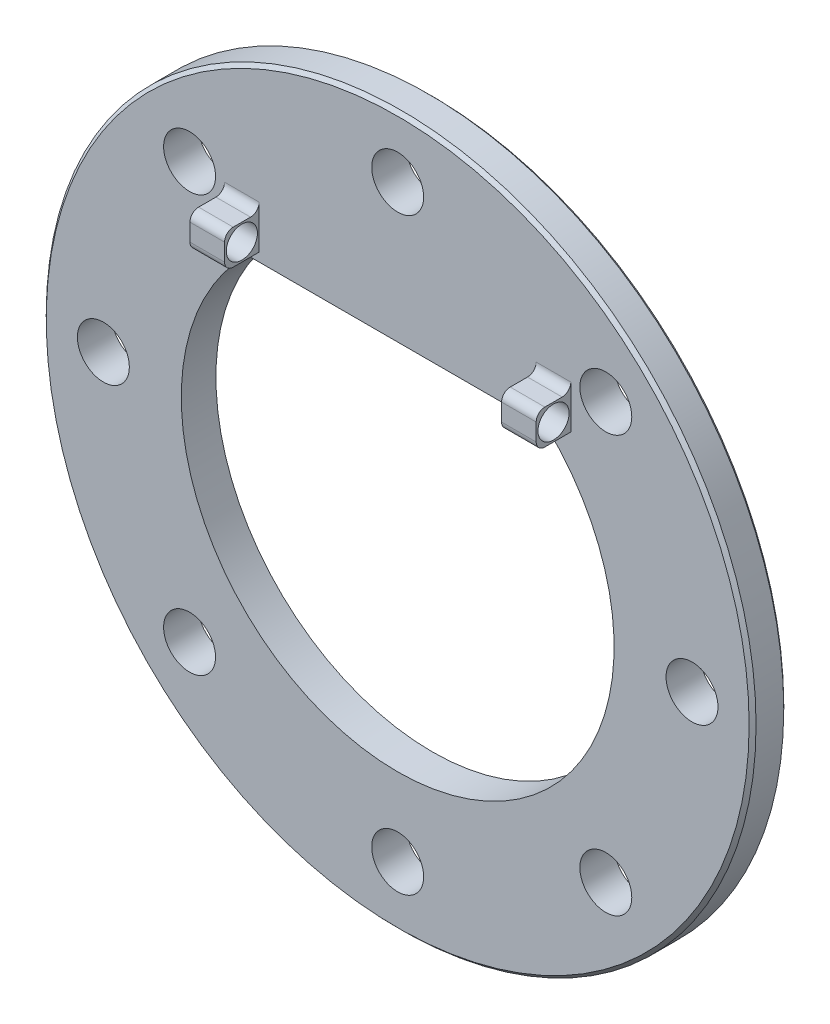
ISO-10303-21;
HEADER;
FILE_DESCRIPTION(('STEP AP214'),'2;1');
FILE_NAME('part.step','',(''),(''),'','','');
FILE_SCHEMA(('AUTOMOTIVE_DESIGN { 1 0 10303 214 1 1 1 1 }'));
ENDSEC;
DATA;
#1=APPLICATION_CONTEXT('core data for automotive mechanical design processes');
#2=APPLICATION_PROTOCOL_DEFINITION('international standard','automotive_design',2000,#1);
#3=PRODUCT_CONTEXT('',#1,'mechanical');
#4=PRODUCT('Part','Part','',(#3));
#5=PRODUCT_RELATED_PRODUCT_CATEGORY('part','',(#4));
#6=PRODUCT_DEFINITION_FORMATION('','',#4);
#7=PRODUCT_DEFINITION_CONTEXT('part definition',#1,'design');
#8=PRODUCT_DEFINITION('design','',#6,#7);
#9=PRODUCT_DEFINITION_SHAPE('','',#8);
#10=(LENGTH_UNIT() NAMED_UNIT(*) SI_UNIT(.MILLI.,.METRE.));
#11=(NAMED_UNIT(*) PLANE_ANGLE_UNIT() SI_UNIT($,.RADIAN.));
#12=(NAMED_UNIT(*) SI_UNIT($,.STERADIAN.) SOLID_ANGLE_UNIT());
#13=UNCERTAINTY_MEASURE_WITH_UNIT(LENGTH_MEASURE(1.E-05),#10,'distance_accuracy_value','');
#14=(GEOMETRIC_REPRESENTATION_CONTEXT(3) GLOBAL_UNCERTAINTY_ASSIGNED_CONTEXT((#13)) GLOBAL_UNIT_ASSIGNED_CONTEXT((#10,
#11,#12)) REPRESENTATION_CONTEXT('',''));
#15=CARTESIAN_POINT('',(0.,0.,0.));
#16=DIRECTION('',(0.,0.,1.));
#17=DIRECTION('',(1.,0.,0.));
#18=AXIS2_PLACEMENT_3D('',#15,#16,#17);
#19=CARTESIAN_POINT('',(0.,0.,20.));
#20=DIRECTION('',(0.,0.,1.));
#21=DIRECTION('',(1.,0.,0.));
#22=AXIS2_PLACEMENT_3D('',#19,#20,#21);
#23=PLANE('',#22);
#24=CARTESIAN_POINT('',(0.,0.,20.));
#25=DIRECTION('',(0.,0.,1.));
#26=DIRECTION('',(1.,0.,0.));
#27=AXIS2_PLACEMENT_3D('',#24,#25,#26);
#28=CIRCLE('',#27,125.);
#29=CARTESIAN_POINT('',(-86.7467578644874,90.,20.));
#30=VERTEX_POINT('',#29);
#31=CARTESIAN_POINT('',(86.7467578644874,90.,20.));
#32=VERTEX_POINT('',#31);
#33=EDGE_CURVE('E199',#30,#32,#28,.T.);
#34=ORIENTED_EDGE('',*,*,#33,.F.);
#35=DIRECTION('',(-1.,0.,0.));
#36=VECTOR('',#35,1.);
#37=CARTESIAN_POINT('',(-86.7467578644874,90.,20.));
#38=LINE('',#37,#36);
#39=EDGE_CURVE('E206',#32,#30,#38,.T.);
#40=ORIENTED_EDGE('',*,*,#39,.F.);
#41=EDGE_LOOP('',(#34,#40));
#42=FACE_BOUND('',#41,.T.);
#43=CARTESIAN_POINT('',(0.,0.,20.));
#44=DIRECTION('',(0.,0.,1.));
#45=DIRECTION('',(1.,0.,0.));
#46=AXIS2_PLACEMENT_3D('',#43,#44,#45);
#47=CIRCLE('',#46,203.);
#48=CARTESIAN_POINT('',(203.,0.,20.));
#49=VERTEX_POINT('',#48);
#50=EDGE_CURVE('E271',#49,#49,#47,.T.);
#51=ORIENTED_EDGE('',*,*,#50,.T.);
#52=EDGE_LOOP('',(#51));
#53=FACE_BOUND('',#52,.T.);
#54=CARTESIAN_POINT('',(-169.999999999992,-7.67202457601036E-12,20.));
#55=DIRECTION('',(0.,0.,1.));
#56=DIRECTION('',(1.,0.,0.));
#57=AXIS2_PLACEMENT_3D('',#54,#55,#56);
#58=CIRCLE('',#57,15.);
#59=CARTESIAN_POINT('',(-154.999999999992,-7.67202457601036E-12,20.));
#60=VERTEX_POINT('',#59);
#61=EDGE_CURVE('E221',#60,#60,#58,.T.);
#62=ORIENTED_EDGE('',*,*,#61,.F.);
#63=EDGE_LOOP('',(#62));
#64=FACE_BOUND('',#63,.T.);
#65=CARTESIAN_POINT('',(1.53024111608497E-11,-170.,20.));
#66=DIRECTION('',(0.,0.,1.));
#67=DIRECTION('',(1.,0.,0.));
#68=AXIS2_PLACEMENT_3D('',#65,#66,#67);
#69=CIRCLE('',#68,15.);
#70=CARTESIAN_POINT('',(15.0000000000153,-170.,20.));
#71=VERTEX_POINT('',#70);
#72=EDGE_CURVE('E233',#71,#71,#69,.T.);
#73=ORIENTED_EDGE('',*,*,#72,.F.);
#74=EDGE_LOOP('',(#73));
#75=FACE_BOUND('',#74,.T.);
#76=CARTESIAN_POINT('',(170.000000000008,7.65120558042486E-12,20.));
#77=DIRECTION('',(0.,0.,1.));
#78=DIRECTION('',(1.,0.,0.));
#79=AXIS2_PLACEMENT_3D('',#76,#77,#78);
#80=CIRCLE('',#79,15.);
#81=CARTESIAN_POINT('',(185.000000000008,7.65120558042486E-12,20.));
#82=VERTEX_POINT('',#81);
#83=EDGE_CURVE('E245',#82,#82,#80,.T.);
#84=ORIENTED_EDGE('',*,*,#83,.F.);
#85=EDGE_LOOP('',(#84));
#86=FACE_BOUND('',#85,.T.);
#87=CARTESIAN_POINT('',(0.,170.,20.));
#88=DIRECTION('',(0.,0.,1.));
#89=DIRECTION('',(1.,0.,0.));
#90=AXIS2_PLACEMENT_3D('',#87,#88,#89);
#91=CIRCLE('',#90,15.);
#92=CARTESIAN_POINT('',(15.,170.,20.));
#93=VERTEX_POINT('',#92);
#94=EDGE_CURVE('E257',#93,#93,#91,.T.);
#95=ORIENTED_EDGE('',*,*,#94,.F.);
#96=EDGE_LOOP('',(#95));
#97=FACE_BOUND('',#96,.T.);
#98=CARTESIAN_POINT('',(120.208152801715,120.208152801718,20.));
#99=DIRECTION('',(0.,0.,1.));
#100=DIRECTION('',(1.,0.,0.));
#101=AXIS2_PLACEMENT_3D('',#98,#99,#100);
#102=CIRCLE('',#101,15.0000000000009);
#103=CARTESIAN_POINT('',(135.208152801716,120.208152801718,20.));
#104=VERTEX_POINT('',#103);
#105=EDGE_CURVE('E251',#104,#104,#102,.T.);
#106=ORIENTED_EDGE('',*,*,#105,.F.);
#107=EDGE_LOOP('',(#106));
#108=FACE_BOUND('',#107,.T.);
#109=CARTESIAN_POINT('',(120.208152801726,-120.208152801708,20.));
#110=DIRECTION('',(0.,0.,1.));
#111=DIRECTION('',(1.,0.,0.));
#112=AXIS2_PLACEMENT_3D('',#109,#110,#111);
#113=CIRCLE('',#112,15.);
#114=CARTESIAN_POINT('',(135.208152801726,-120.208152801708,20.));
#115=VERTEX_POINT('',#114);
#116=EDGE_CURVE('E239',#115,#115,#113,.T.);
#117=ORIENTED_EDGE('',*,*,#116,.F.);
#118=EDGE_LOOP('',(#117));
#119=FACE_BOUND('',#118,.T.);
#120=CARTESIAN_POINT('',(-120.2081528017,-120.208152801719,20.));
#121=DIRECTION('',(0.,0.,1.));
#122=DIRECTION('',(1.,0.,0.));
#123=AXIS2_PLACEMENT_3D('',#120,#121,#122);
#124=CIRCLE('',#123,15.);
#125=CARTESIAN_POINT('',(-105.2081528017,-120.208152801719,20.));
#126=VERTEX_POINT('',#125);
#127=EDGE_CURVE('E227',#126,#126,#124,.T.);
#128=ORIENTED_EDGE('',*,*,#127,.F.);
#129=EDGE_LOOP('',(#128));
#130=FACE_BOUND('',#129,.T.);
#131=CARTESIAN_POINT('',(-120.208152801711,120.208152801708,20.));
#132=DIRECTION('',(0.,0.,1.));
#133=DIRECTION('',(1.,0.,0.));
#134=AXIS2_PLACEMENT_3D('',#131,#132,#133);
#135=CIRCLE('',#134,15.);
#136=CARTESIAN_POINT('',(-105.208152801711,120.208152801708,20.));
#137=VERTEX_POINT('',#136);
#138=EDGE_CURVE('E215',#137,#137,#135,.T.);
#139=ORIENTED_EDGE('',*,*,#138,.F.);
#140=EDGE_LOOP('',(#139));
#141=FACE_BOUND('',#140,.T.);
#142=DIRECTION('',(0.,-1.,0.));
#143=VECTOR('',#142,1.);
#144=CARTESIAN_POINT('',(-100.,95.,20.));
#145=LINE('',#144,#143);
#146=CARTESIAN_POINT('',(-100.,120.,20.));
#147=VERTEX_POINT('',#146);
#148=CARTESIAN_POINT('',(-100.,95.,20.));
#149=VERTEX_POINT('',#148);
#150=EDGE_CURVE('E175',#147,#149,#145,.T.);
#151=ORIENTED_EDGE('',*,*,#150,.F.);
#152=DIRECTION('',(-1.,0.,0.));
#153=VECTOR('',#152,1.);
#154=CARTESIAN_POINT('',(0.,120.,20.));
#155=LINE('',#154,#153);
#156=CARTESIAN_POINT('',(-80.,120.,20.));
#157=VERTEX_POINT('',#156);
#158=EDGE_CURVE('E297',#147,#157,#155,.F.);
#159=ORIENTED_EDGE('',*,*,#158,.T.);
#160=DIRECTION('',(0.,1.,0.));
#161=VECTOR('',#160,1.);
#162=CARTESIAN_POINT('',(-80.,115.,20.));
#163=LINE('',#162,#161);
#164=CARTESIAN_POINT('',(-80.,95.,20.));
#165=VERTEX_POINT('',#164);
#166=EDGE_CURVE('E180',#165,#157,#163,.T.);
#167=ORIENTED_EDGE('',*,*,#166,.F.);
#168=DIRECTION('',(1.,0.,0.));
#169=VECTOR('',#168,1.);
#170=CARTESIAN_POINT('',(-100.,95.,20.));
#171=LINE('',#170,#169);
#172=EDGE_CURVE('E186',#149,#165,#171,.T.);
#173=ORIENTED_EDGE('',*,*,#172,.F.);
#174=EDGE_LOOP('',(#151,#159,#167,#173));
#175=FACE_BOUND('',#174,.T.);
#176=DIRECTION('',(0.,-1.,0.));
#177=VECTOR('',#176,1.);
#178=CARTESIAN_POINT('',(80.,115.,20.));
#179=LINE('',#178,#177);
#180=CARTESIAN_POINT('',(80.,120.,20.));
#181=VERTEX_POINT('',#180);
#182=CARTESIAN_POINT('',(80.,95.,20.));
#183=VERTEX_POINT('',#182);
#184=EDGE_CURVE('E155',#181,#183,#179,.T.);
#185=ORIENTED_EDGE('',*,*,#184,.F.);
#186=DIRECTION('',(-1.,0.,0.));
#187=VECTOR('',#186,1.);
#188=CARTESIAN_POINT('',(0.,120.,20.));
#189=LINE('',#188,#187);
#190=CARTESIAN_POINT('',(100.,120.,20.));
#191=VERTEX_POINT('',#190);
#192=EDGE_CURVE('E295',#181,#191,#189,.F.);
#193=ORIENTED_EDGE('',*,*,#192,.T.);
#194=DIRECTION('',(0.,1.,0.));
#195=VECTOR('',#194,1.);
#196=CARTESIAN_POINT('',(100.,95.,20.));
#197=LINE('',#196,#195);
#198=CARTESIAN_POINT('',(100.,95.,20.));
#199=VERTEX_POINT('',#198);
#200=EDGE_CURVE('E163',#199,#191,#197,.T.);
#201=ORIENTED_EDGE('',*,*,#200,.F.);
#202=DIRECTION('',(1.,0.,0.));
#203=VECTOR('',#202,1.);
#204=CARTESIAN_POINT('',(80.,95.,20.));
#205=LINE('',#204,#203);
#206=EDGE_CURVE('E147',#183,#199,#205,.T.);
#207=ORIENTED_EDGE('',*,*,#206,.F.);
#208=EDGE_LOOP('',(#185,#193,#201,#207));
#209=FACE_BOUND('',#208,.T.);
#210=ADVANCED_FACE('F33',(#42,#53,#64,#75,#86,#97,#108,#119,#130,#141,#175,#209),#23,.T.);
#211=CARTESIAN_POINT('',(0.,0.,0.));
#212=DIRECTION('',(0.,0.,1.));
#213=DIRECTION('',(1.,0.,0.));
#214=AXIS2_PLACEMENT_3D('',#211,#212,#213);
#215=PLANE('',#214);
#216=DIRECTION('',(1.,0.,0.));
#217=VECTOR('',#216,1.);
#218=CARTESIAN_POINT('',(-86.7467578644874,90.,0.));
#219=LINE('',#218,#217);
#220=CARTESIAN_POINT('',(-86.7467578644874,90.,0.));
#221=VERTEX_POINT('',#220);
#222=CARTESIAN_POINT('',(86.7467578644874,90.,0.));
#223=VERTEX_POINT('',#222);
#224=EDGE_CURVE('E203',#221,#223,#219,.T.);
#225=ORIENTED_EDGE('',*,*,#224,.F.);
#226=CARTESIAN_POINT('',(0.,0.,0.));
#227=DIRECTION('',(0.,0.,1.));
#228=DIRECTION('',(1.,0.,0.));
#229=AXIS2_PLACEMENT_3D('',#226,#227,#228);
#230=CIRCLE('',#229,125.);
#231=EDGE_CURVE('E200',#223,#221,#230,.F.);
#232=ORIENTED_EDGE('',*,*,#231,.F.);
#233=EDGE_LOOP('',(#225,#232));
#234=FACE_BOUND('',#233,.T.);
#235=CARTESIAN_POINT('',(0.,0.,0.));
#236=DIRECTION('',(0.,0.,1.));
#237=DIRECTION('',(1.,0.,0.));
#238=AXIS2_PLACEMENT_3D('',#235,#236,#237);
#239=CIRCLE('',#238,203.);
#240=CARTESIAN_POINT('',(203.,0.,0.));
#241=VERTEX_POINT('',#240);
#242=EDGE_CURVE('E268',#241,#241,#239,.F.);
#243=ORIENTED_EDGE('',*,*,#242,.T.);
#244=EDGE_LOOP('',(#243));
#245=FACE_BOUND('',#244,.T.);
#246=CARTESIAN_POINT('',(0.,170.,0.));
#247=DIRECTION('',(0.,0.,1.));
#248=DIRECTION('',(1.,0.,0.));
#249=AXIS2_PLACEMENT_3D('',#246,#247,#248);
#250=CIRCLE('',#249,15.);
#251=CARTESIAN_POINT('',(15.,170.,0.));
#252=VERTEX_POINT('',#251);
#253=EDGE_CURVE('E254',#252,#252,#250,.T.);
#254=ORIENTED_EDGE('',*,*,#253,.T.);
#255=EDGE_LOOP('',(#254));
#256=FACE_BOUND('',#255,.T.);
#257=CARTESIAN_POINT('',(120.208152801715,120.208152801718,0.));
#258=DIRECTION('',(0.,0.,1.));
#259=DIRECTION('',(1.,0.,0.));
#260=AXIS2_PLACEMENT_3D('',#257,#258,#259);
#261=CIRCLE('',#260,15.0000000000009);
#262=CARTESIAN_POINT('',(135.208152801716,120.208152801718,0.));
#263=VERTEX_POINT('',#262);
#264=EDGE_CURVE('E248',#263,#263,#261,.T.);
#265=ORIENTED_EDGE('',*,*,#264,.T.);
#266=EDGE_LOOP('',(#265));
#267=FACE_BOUND('',#266,.T.);
#268=CARTESIAN_POINT('',(170.000000000008,7.65120558042486E-12,0.));
#269=DIRECTION('',(0.,0.,1.));
#270=DIRECTION('',(1.,0.,0.));
#271=AXIS2_PLACEMENT_3D('',#268,#269,#270);
#272=CIRCLE('',#271,15.);
#273=CARTESIAN_POINT('',(185.000000000008,7.65120558042486E-12,0.));
#274=VERTEX_POINT('',#273);
#275=EDGE_CURVE('E242',#274,#274,#272,.T.);
#276=ORIENTED_EDGE('',*,*,#275,.T.);
#277=EDGE_LOOP('',(#276));
#278=FACE_BOUND('',#277,.T.);
#279=CARTESIAN_POINT('',(120.208152801726,-120.208152801708,0.));
#280=DIRECTION('',(0.,0.,1.));
#281=DIRECTION('',(1.,0.,0.));
#282=AXIS2_PLACEMENT_3D('',#279,#280,#281);
#283=CIRCLE('',#282,15.);
#284=CARTESIAN_POINT('',(135.208152801726,-120.208152801708,0.));
#285=VERTEX_POINT('',#284);
#286=EDGE_CURVE('E236',#285,#285,#283,.T.);
#287=ORIENTED_EDGE('',*,*,#286,.T.);
#288=EDGE_LOOP('',(#287));
#289=FACE_BOUND('',#288,.T.);
#290=CARTESIAN_POINT('',(1.53024111608497E-11,-170.,0.));
#291=DIRECTION('',(0.,0.,1.));
#292=DIRECTION('',(1.,0.,0.));
#293=AXIS2_PLACEMENT_3D('',#290,#291,#292);
#294=CIRCLE('',#293,15.);
#295=CARTESIAN_POINT('',(15.0000000000153,-170.,0.));
#296=VERTEX_POINT('',#295);
#297=EDGE_CURVE('E230',#296,#296,#294,.T.);
#298=ORIENTED_EDGE('',*,*,#297,.T.);
#299=EDGE_LOOP('',(#298));
#300=FACE_BOUND('',#299,.T.);
#301=CARTESIAN_POINT('',(-120.2081528017,-120.208152801719,0.));
#302=DIRECTION('',(0.,0.,1.));
#303=DIRECTION('',(1.,0.,0.));
#304=AXIS2_PLACEMENT_3D('',#301,#302,#303);
#305=CIRCLE('',#304,15.);
#306=CARTESIAN_POINT('',(-105.2081528017,-120.208152801719,0.));
#307=VERTEX_POINT('',#306);
#308=EDGE_CURVE('E224',#307,#307,#305,.T.);
#309=ORIENTED_EDGE('',*,*,#308,.T.);
#310=EDGE_LOOP('',(#309));
#311=FACE_BOUND('',#310,.T.);
#312=CARTESIAN_POINT('',(-169.999999999992,-7.67202457601036E-12,0.));
#313=DIRECTION('',(0.,0.,1.));
#314=DIRECTION('',(1.,0.,0.));
#315=AXIS2_PLACEMENT_3D('',#312,#313,#314);
#316=CIRCLE('',#315,15.);
#317=CARTESIAN_POINT('',(-154.999999999992,-7.67202457601036E-12,0.));
#318=VERTEX_POINT('',#317);
#319=EDGE_CURVE('E218',#318,#318,#316,.T.);
#320=ORIENTED_EDGE('',*,*,#319,.T.);
#321=EDGE_LOOP('',(#320));
#322=FACE_BOUND('',#321,.T.);
#323=CARTESIAN_POINT('',(-120.208152801711,120.208152801708,0.));
#324=DIRECTION('',(0.,0.,1.));
#325=DIRECTION('',(1.,0.,0.));
#326=AXIS2_PLACEMENT_3D('',#323,#324,#325);
#327=CIRCLE('',#326,15.);
#328=CARTESIAN_POINT('',(-105.208152801711,120.208152801708,0.));
#329=VERTEX_POINT('',#328);
#330=EDGE_CURVE('E214',#329,#329,#327,.T.);
#331=ORIENTED_EDGE('',*,*,#330,.T.);
#332=EDGE_LOOP('',(#331));
#333=FACE_BOUND('',#332,.T.);
#334=ADVANCED_FACE('F358',(#234,#245,#256,#267,#278,#289,#300,#311,#322,#333),#215,.F.);
#335=CARTESIAN_POINT('',(0.,0.,20.));
#336=DIRECTION('',(0.,0.,-1.));
#337=DIRECTION('',(-1.,0.,0.));
#338=AXIS2_PLACEMENT_3D('',#335,#336,#337);
#339=CYLINDRICAL_SURFACE('',#338,205.);
#340=CARTESIAN_POINT('',(0.,0.,2.00000000000006));
#341=DIRECTION('',(0.,0.,1.));
#342=DIRECTION('',(1.,0.,0.));
#343=AXIS2_PLACEMENT_3D('',#340,#341,#342);
#344=CIRCLE('',#343,205.);
#345=CARTESIAN_POINT('',(205.,0.,2.00000000000006));
#346=VERTEX_POINT('',#345);
#347=EDGE_CURVE('E265',#346,#346,#344,.T.);
#348=ORIENTED_EDGE('',*,*,#347,.T.);
#349=EDGE_LOOP('',(#348));
#350=FACE_BOUND('',#349,.T.);
#351=CARTESIAN_POINT('',(0.,0.,18.));
#352=DIRECTION('',(0.,0.,1.));
#353=DIRECTION('',(1.,0.,0.));
#354=AXIS2_PLACEMENT_3D('',#351,#352,#353);
#355=CIRCLE('',#354,205.);
#356=CARTESIAN_POINT('',(205.,0.,18.));
#357=VERTEX_POINT('',#356);
#358=EDGE_CURVE('E260',#357,#357,#355,.F.);
#359=ORIENTED_EDGE('',*,*,#358,.T.);
#360=EDGE_LOOP('',(#359));
#361=FACE_BOUND('',#360,.T.);
#362=ADVANCED_FACE('F366',(#350,#361),#339,.T.);
#363=CARTESIAN_POINT('',(0.,170.,20.));
#364=DIRECTION('',(0.,0.,-1.));
#365=DIRECTION('',(-1.,0.,0.));
#366=AXIS2_PLACEMENT_3D('',#363,#364,#365);
#367=CYLINDRICAL_SURFACE('',#366,15.);
#368=ORIENTED_EDGE('',*,*,#94,.T.);
#369=EDGE_LOOP('',(#368));
#370=FACE_BOUND('',#369,.T.);
#371=ORIENTED_EDGE('',*,*,#253,.F.);
#372=EDGE_LOOP('',(#371));
#373=FACE_BOUND('',#372,.T.);
#374=ADVANCED_FACE('F372',(#370,#373),#367,.F.);
#375=CARTESIAN_POINT('',(120.208152801715,120.208152801718,20.));
#376=DIRECTION('',(0.,0.,-1.));
#377=DIRECTION('',(-1.,0.,0.));
#378=AXIS2_PLACEMENT_3D('',#375,#376,#377);
#379=CYLINDRICAL_SURFACE('',#378,15.0000000000009);
#380=ORIENTED_EDGE('',*,*,#105,.T.);
#381=EDGE_LOOP('',(#380));
#382=FACE_BOUND('',#381,.T.);
#383=ORIENTED_EDGE('',*,*,#264,.F.);
#384=EDGE_LOOP('',(#383));
#385=FACE_BOUND('',#384,.T.);
#386=ADVANCED_FACE('F486',(#382,#385),#379,.F.);
#387=CARTESIAN_POINT('',(170.000000000008,7.65120558042486E-12,20.));
#388=DIRECTION('',(0.,0.,-1.));
#389=DIRECTION('',(-1.,0.,0.));
#390=AXIS2_PLACEMENT_3D('',#387,#388,#389);
#391=CYLINDRICAL_SURFACE('',#390,15.);
#392=ORIENTED_EDGE('',*,*,#83,.T.);
#393=EDGE_LOOP('',(#392));
#394=FACE_BOUND('',#393,.T.);
#395=ORIENTED_EDGE('',*,*,#275,.F.);
#396=EDGE_LOOP('',(#395));
#397=FACE_BOUND('',#396,.T.);
#398=ADVANCED_FACE('F483',(#394,#397),#391,.F.);
#399=CARTESIAN_POINT('',(120.208152801726,-120.208152801708,20.));
#400=DIRECTION('',(0.,0.,-1.));
#401=DIRECTION('',(-1.,0.,0.));
#402=AXIS2_PLACEMENT_3D('',#399,#400,#401);
#403=CYLINDRICAL_SURFACE('',#402,15.);
#404=ORIENTED_EDGE('',*,*,#116,.T.);
#405=EDGE_LOOP('',(#404));
#406=FACE_BOUND('',#405,.T.);
#407=ORIENTED_EDGE('',*,*,#286,.F.);
#408=EDGE_LOOP('',(#407));
#409=FACE_BOUND('',#408,.T.);
#410=ADVANCED_FACE('F479',(#406,#409),#403,.F.);
#411=CARTESIAN_POINT('',(1.53024111608497E-11,-170.,20.));
#412=DIRECTION('',(0.,0.,-1.));
#413=DIRECTION('',(-1.,0.,0.));
#414=AXIS2_PLACEMENT_3D('',#411,#412,#413);
#415=CYLINDRICAL_SURFACE('',#414,15.);
#416=ORIENTED_EDGE('',*,*,#72,.T.);
#417=EDGE_LOOP('',(#416));
#418=FACE_BOUND('',#417,.T.);
#419=ORIENTED_EDGE('',*,*,#297,.F.);
#420=EDGE_LOOP('',(#419));
#421=FACE_BOUND('',#420,.T.);
#422=ADVANCED_FACE('F475',(#418,#421),#415,.F.);
#423=CARTESIAN_POINT('',(-120.2081528017,-120.208152801719,20.));
#424=DIRECTION('',(0.,0.,-1.));
#425=DIRECTION('',(-1.,0.,0.));
#426=AXIS2_PLACEMENT_3D('',#423,#424,#425);
#427=CYLINDRICAL_SURFACE('',#426,15.);
#428=ORIENTED_EDGE('',*,*,#127,.T.);
#429=EDGE_LOOP('',(#428));
#430=FACE_BOUND('',#429,.T.);
#431=ORIENTED_EDGE('',*,*,#308,.F.);
#432=EDGE_LOOP('',(#431));
#433=FACE_BOUND('',#432,.T.);
#434=ADVANCED_FACE('F471',(#430,#433),#427,.F.);
#435=CARTESIAN_POINT('',(-169.999999999992,-7.67202457601036E-12,20.));
#436=DIRECTION('',(0.,0.,-1.));
#437=DIRECTION('',(-1.,0.,0.));
#438=AXIS2_PLACEMENT_3D('',#435,#436,#437);
#439=CYLINDRICAL_SURFACE('',#438,15.);
#440=ORIENTED_EDGE('',*,*,#61,.T.);
#441=EDGE_LOOP('',(#440));
#442=FACE_BOUND('',#441,.T.);
#443=ORIENTED_EDGE('',*,*,#319,.F.);
#444=EDGE_LOOP('',(#443));
#445=FACE_BOUND('',#444,.T.);
#446=ADVANCED_FACE('F467',(#442,#445),#439,.F.);
#447=CARTESIAN_POINT('',(-120.208152801711,120.208152801708,20.));
#448=DIRECTION('',(0.,0.,-1.));
#449=DIRECTION('',(-1.,0.,0.));
#450=AXIS2_PLACEMENT_3D('',#447,#448,#449);
#451=CYLINDRICAL_SURFACE('',#450,15.);
#452=ORIENTED_EDGE('',*,*,#138,.T.);
#453=EDGE_LOOP('',(#452));
#454=FACE_BOUND('',#453,.T.);
#455=ORIENTED_EDGE('',*,*,#330,.F.);
#456=EDGE_LOOP('',(#455));
#457=FACE_BOUND('',#456,.T.);
#458=ADVANCED_FACE('F382',(#454,#457),#451,.F.);
#459=CARTESIAN_POINT('',(0.,0.,2.00000000000006));
#460=DIRECTION('',(0.,0.,1.));
#461=DIRECTION('',(1.,0.,0.));
#462=AXIS2_PLACEMENT_3D('',#459,#460,#461);
#463=CONICAL_SURFACE('',#462,205.,0.785398163397441);
#464=ORIENTED_EDGE('',*,*,#242,.F.);
#465=EDGE_LOOP('',(#464));
#466=FACE_BOUND('',#465,.T.);
#467=ORIENTED_EDGE('',*,*,#347,.F.);
#468=EDGE_LOOP('',(#467));
#469=FACE_BOUND('',#468,.T.);
#470=ADVANCED_FACE('F378',(#466,#469),#463,.T.);
#471=CARTESIAN_POINT('',(0.,0.,20.));
#472=DIRECTION('',(0.,0.,-1.));
#473=DIRECTION('',(-1.,0.,0.));
#474=AXIS2_PLACEMENT_3D('',#471,#472,#473);
#475=CONICAL_SURFACE('',#474,203.,0.785398163397469);
#476=ORIENTED_EDGE('',*,*,#358,.F.);
#477=EDGE_LOOP('',(#476));
#478=FACE_BOUND('',#477,.T.);
#479=ORIENTED_EDGE('',*,*,#50,.F.);
#480=EDGE_LOOP('',(#479));
#481=FACE_BOUND('',#480,.T.);
#482=ADVANCED_FACE('F381',(#478,#481),#475,.T.);
#483=CARTESIAN_POINT('',(0.,0.,-329.734741875951));
#484=DIRECTION('',(0.,0.,1.));
#485=DIRECTION('',(1.,0.,0.));
#486=AXIS2_PLACEMENT_3D('',#483,#484,#485);
#487=CYLINDRICAL_SURFACE('',#486,125.);
#488=ORIENTED_EDGE('',*,*,#231,.T.);
#489=DIRECTION('',(0.,0.,1.));
#490=VECTOR('',#489,1.);
#491=CARTESIAN_POINT('',(-86.7467578644874,90.,-329.734741875951));
#492=LINE('',#491,#490);
#493=EDGE_CURVE('E204',#221,#30,#492,.T.);
#494=ORIENTED_EDGE('',*,*,#493,.T.);
#495=ORIENTED_EDGE('',*,*,#33,.T.);
#496=DIRECTION('',(0.,0.,1.));
#497=VECTOR('',#496,1.);
#498=CARTESIAN_POINT('',(86.7467578644874,90.,-329.734741875951));
#499=LINE('',#498,#497);
#500=EDGE_CURVE('E209',#223,#32,#499,.T.);
#501=ORIENTED_EDGE('',*,*,#500,.F.);
#502=EDGE_LOOP('',(#488,#494,#495,#501));
#503=FACE_BOUND('',#502,.T.);
#504=ADVANCED_FACE('F386',(#503),#487,.F.);
#505=CARTESIAN_POINT('',(-86.7467578644874,90.,-329.734741875951));
#506=DIRECTION('',(0.,1.,0.));
#507=DIRECTION('',(0.,0.,1.));
#508=AXIS2_PLACEMENT_3D('',#505,#506,#507);
#509=PLANE('',#508);
#510=ORIENTED_EDGE('',*,*,#224,.T.);
#511=ORIENTED_EDGE('',*,*,#500,.T.);
#512=ORIENTED_EDGE('',*,*,#39,.T.);
#513=ORIENTED_EDGE('',*,*,#493,.F.);
#514=EDGE_LOOP('',(#510,#511,#512,#513));
#515=FACE_BOUND('',#514,.T.);
#516=ADVANCED_FACE('F457',(#515),#509,.F.);
#517=CARTESIAN_POINT('',(-100.,95.,40.));
#518=DIRECTION('',(1.,0.,0.));
#519=DIRECTION('',(0.,0.,-1.));
#520=AXIS2_PLACEMENT_3D('',#517,#518,#519);
#521=PLANE('',#520);
#522=CARTESIAN_POINT('',(-100.,105.,30.));
#523=DIRECTION('',(1.,0.,0.));
#524=DIRECTION('',(0.,0.,-1.));
#525=AXIS2_PLACEMENT_3D('',#522,#523,#524);
#526=CIRCLE('',#525,8.99999999999999);
#527=CARTESIAN_POINT('',(-100.,105.,21.));
#528=VERTEX_POINT('',#527);
#529=EDGE_CURVE('E419',#528,#528,#526,.F.);
#530=ORIENTED_EDGE('',*,*,#529,.F.);
#531=EDGE_LOOP('',(#530));
#532=FACE_BOUND('',#531,.T.);
#533=DIRECTION('',(0.,0.,-1.));
#534=VECTOR('',#533,1.);
#535=CARTESIAN_POINT('',(-100.,95.,40.));
#536=LINE('',#535,#534);
#537=CARTESIAN_POINT('',(-100.,95.,35.));
#538=VERTEX_POINT('',#537);
#539=EDGE_CURVE('E197',#538,#149,#536,.T.);
#540=ORIENTED_EDGE('',*,*,#539,.F.);
#541=CARTESIAN_POINT('',(-100.,100.,35.));
#542=DIRECTION('',(1.,0.,0.));
#543=DIRECTION('',(0.,0.,-1.));
#544=AXIS2_PLACEMENT_3D('',#541,#542,#543);
#545=CIRCLE('',#544,5.);
#546=CARTESIAN_POINT('',(-100.,100.,40.));
#547=VERTEX_POINT('',#546);
#548=EDGE_CURVE('E288',#538,#547,#545,.F.);
#549=ORIENTED_EDGE('',*,*,#548,.T.);
#550=DIRECTION('',(0.,-1.,0.));
#551=VECTOR('',#550,1.);
#552=CARTESIAN_POINT('',(-100.,95.,40.));
#553=LINE('',#552,#551);
#554=CARTESIAN_POINT('',(-100.,110.,40.));
#555=VERTEX_POINT('',#554);
#556=EDGE_CURVE('E176',#555,#547,#553,.T.);
#557=ORIENTED_EDGE('',*,*,#556,.F.);
#558=CARTESIAN_POINT('',(-100.,110.,35.));
#559=DIRECTION('',(1.,0.,0.));
#560=DIRECTION('',(0.,0.,-1.));
#561=AXIS2_PLACEMENT_3D('',#558,#559,#560);
#562=CIRCLE('',#561,5.);
#563=CARTESIAN_POINT('',(-100.,115.,35.));
#564=VERTEX_POINT('',#563);
#565=EDGE_CURVE('E286',#555,#564,#562,.F.);
#566=ORIENTED_EDGE('',*,*,#565,.T.);
#567=DIRECTION('',(0.,0.,-1.));
#568=VECTOR('',#567,1.);
#569=CARTESIAN_POINT('',(-100.,115.,40.));
#570=LINE('',#569,#568);
#571=CARTESIAN_POINT('',(-100.,115.,25.));
#572=VERTEX_POINT('',#571);
#573=EDGE_CURVE('E183',#564,#572,#570,.T.);
#574=ORIENTED_EDGE('',*,*,#573,.T.);
#575=CARTESIAN_POINT('',(-100.,120.,25.));
#576=DIRECTION('',(1.,0.,0.));
#577=DIRECTION('',(0.,0.,-1.));
#578=AXIS2_PLACEMENT_3D('',#575,#576,#577);
#579=CIRCLE('',#578,5.);
#580=EDGE_CURVE('E319',#572,#147,#579,.T.);
#581=ORIENTED_EDGE('',*,*,#580,.T.);
#582=ORIENTED_EDGE('',*,*,#150,.T.);
#583=EDGE_LOOP('',(#540,#549,#557,#566,#574,#581,#582));
#584=FACE_BOUND('',#583,.T.);
#585=ADVANCED_FACE('F340',(#532,#584),#521,.F.);
#586=CARTESIAN_POINT('',(-100.,95.,40.));
#587=DIRECTION('',(0.,1.,0.));
#588=DIRECTION('',(0.,0.,1.));
#589=AXIS2_PLACEMENT_3D('',#586,#587,#588);
#590=PLANE('',#589);
#591=DIRECTION('',(0.,0.,-1.));
#592=VECTOR('',#591,1.);
#593=CARTESIAN_POINT('',(-80.,95.,40.));
#594=LINE('',#593,#592);
#595=CARTESIAN_POINT('',(-80.,95.,35.));
#596=VERTEX_POINT('',#595);
#597=EDGE_CURVE('E195',#596,#165,#594,.T.);
#598=ORIENTED_EDGE('',*,*,#597,.F.);
#599=DIRECTION('',(1.,0.,0.));
#600=VECTOR('',#599,1.);
#601=CARTESIAN_POINT('',(-100.,95.,35.));
#602=LINE('',#601,#600);
#603=EDGE_CURVE('E284',#596,#538,#602,.F.);
#604=ORIENTED_EDGE('',*,*,#603,.T.);
#605=ORIENTED_EDGE('',*,*,#539,.T.);
#606=ORIENTED_EDGE('',*,*,#172,.T.);
#607=EDGE_LOOP('',(#598,#604,#605,#606));
#608=FACE_BOUND('',#607,.T.);
#609=ADVANCED_FACE('F355',(#608),#590,.F.);
#610=CARTESIAN_POINT('',(-80.,115.,40.));
#611=DIRECTION('',(-1.,0.,0.));
#612=DIRECTION('',(0.,0.,1.));
#613=AXIS2_PLACEMENT_3D('',#610,#611,#612);
#614=PLANE('',#613);
#615=CARTESIAN_POINT('',(-80.,105.,30.));
#616=DIRECTION('',(-1.,0.,0.));
#617=DIRECTION('',(0.,0.,1.));
#618=AXIS2_PLACEMENT_3D('',#615,#616,#617);
#619=CIRCLE('',#618,8.99999999999999);
#620=CARTESIAN_POINT('',(-80.,105.,39.));
#621=VERTEX_POINT('',#620);
#622=EDGE_CURVE('E161',#621,#621,#619,.T.);
#623=ORIENTED_EDGE('',*,*,#622,.T.);
#624=EDGE_LOOP('',(#623));
#625=FACE_BOUND('',#624,.T.);
#626=DIRECTION('',(0.,1.,0.));
#627=VECTOR('',#626,1.);
#628=CARTESIAN_POINT('',(-80.,115.,40.));
#629=LINE('',#628,#627);
#630=CARTESIAN_POINT('',(-80.,100.,40.));
#631=VERTEX_POINT('',#630);
#632=CARTESIAN_POINT('',(-80.,110.,40.));
#633=VERTEX_POINT('',#632);
#634=EDGE_CURVE('E179',#631,#633,#629,.T.);
#635=ORIENTED_EDGE('',*,*,#634,.F.);
#636=CARTESIAN_POINT('',(-80.,100.,35.));
#637=DIRECTION('',(-1.,0.,0.));
#638=DIRECTION('',(0.,0.,1.));
#639=AXIS2_PLACEMENT_3D('',#636,#637,#638);
#640=CIRCLE('',#639,5.);
#641=EDGE_CURVE('E282',#631,#596,#640,.F.);
#642=ORIENTED_EDGE('',*,*,#641,.T.);
#643=ORIENTED_EDGE('',*,*,#597,.T.);
#644=ORIENTED_EDGE('',*,*,#166,.T.);
#645=CARTESIAN_POINT('',(-80.,120.,25.));
#646=DIRECTION('',(-1.,0.,0.));
#647=DIRECTION('',(0.,0.,1.));
#648=AXIS2_PLACEMENT_3D('',#645,#646,#647);
#649=CIRCLE('',#648,5.);
#650=CARTESIAN_POINT('',(-80.,115.,25.));
#651=VERTEX_POINT('',#650);
#652=EDGE_CURVE('E322',#157,#651,#649,.T.);
#653=ORIENTED_EDGE('',*,*,#652,.T.);
#654=DIRECTION('',(0.,0.,-1.));
#655=VECTOR('',#654,1.);
#656=CARTESIAN_POINT('',(-80.,115.,40.));
#657=LINE('',#656,#655);
#658=CARTESIAN_POINT('',(-80.,115.,35.));
#659=VERTEX_POINT('',#658);
#660=EDGE_CURVE('E192',#659,#651,#657,.T.);
#661=ORIENTED_EDGE('',*,*,#660,.F.);
#662=CARTESIAN_POINT('',(-80.,110.,35.));
#663=DIRECTION('',(-1.,0.,0.));
#664=DIRECTION('',(0.,0.,1.));
#665=AXIS2_PLACEMENT_3D('',#662,#663,#664);
#666=CIRCLE('',#665,5.);
#667=EDGE_CURVE('E280',#659,#633,#666,.F.);
#668=ORIENTED_EDGE('',*,*,#667,.T.);
#669=EDGE_LOOP('',(#635,#642,#643,#644,#653,#661,#668));
#670=FACE_BOUND('',#669,.T.);
#671=ADVANCED_FACE('F327',(#625,#670),#614,.F.);
#672=CARTESIAN_POINT('',(-100.,115.,40.));
#673=DIRECTION('',(0.,-1.,0.));
#674=DIRECTION('',(0.,0.,-1.));
#675=AXIS2_PLACEMENT_3D('',#672,#673,#674);
#676=PLANE('',#675);
#677=ORIENTED_EDGE('',*,*,#660,.T.);
#678=DIRECTION('',(-1.,0.,0.));
#679=VECTOR('',#678,1.);
#680=CARTESIAN_POINT('',(-100.,115.,25.));
#681=LINE('',#680,#679);
#682=EDGE_CURVE('E292',#651,#572,#681,.T.);
#683=ORIENTED_EDGE('',*,*,#682,.T.);
#684=ORIENTED_EDGE('',*,*,#573,.F.);
#685=DIRECTION('',(-1.,0.,0.));
#686=VECTOR('',#685,1.);
#687=CARTESIAN_POINT('',(-100.,115.,35.));
#688=LINE('',#687,#686);
#689=EDGE_CURVE('E290',#564,#659,#688,.F.);
#690=ORIENTED_EDGE('',*,*,#689,.T.);
#691=EDGE_LOOP('',(#677,#683,#684,#690));
#692=FACE_BOUND('',#691,.T.);
#693=ADVANCED_FACE('F334',(#692),#676,.F.);
#694=CARTESIAN_POINT('',(0.,0.,40.));
#695=DIRECTION('',(0.,0.,-1.));
#696=DIRECTION('',(-1.,0.,0.));
#697=AXIS2_PLACEMENT_3D('',#694,#695,#696);
#698=PLANE('',#697);
#699=ORIENTED_EDGE('',*,*,#556,.T.);
#700=DIRECTION('',(1.,0.,0.));
#701=VECTOR('',#700,1.);
#702=CARTESIAN_POINT('',(0.,100.,40.));
#703=LINE('',#702,#701);
#704=EDGE_CURVE('E277',#547,#631,#703,.T.);
#705=ORIENTED_EDGE('',*,*,#704,.T.);
#706=ORIENTED_EDGE('',*,*,#634,.T.);
#707=DIRECTION('',(-1.,0.,0.));
#708=VECTOR('',#707,1.);
#709=CARTESIAN_POINT('',(0.,110.,40.));
#710=LINE('',#709,#708);
#711=EDGE_CURVE('E274',#633,#555,#710,.T.);
#712=ORIENTED_EDGE('',*,*,#711,.T.);
#713=EDGE_LOOP('',(#699,#705,#706,#712));
#714=FACE_BOUND('',#713,.T.);
#715=ADVANCED_FACE('F347',(#714),#698,.F.);
#716=CARTESIAN_POINT('',(80.,115.,40.));
#717=DIRECTION('',(0.,-1.,0.));
#718=DIRECTION('',(0.,0.,-1.));
#719=AXIS2_PLACEMENT_3D('',#716,#717,#718);
#720=PLANE('',#719);
#721=DIRECTION('',(0.,0.,-1.));
#722=VECTOR('',#721,1.);
#723=CARTESIAN_POINT('',(100.,115.,40.));
#724=LINE('',#723,#722);
#725=CARTESIAN_POINT('',(100.,115.,35.));
#726=VERTEX_POINT('',#725);
#727=CARTESIAN_POINT('',(100.,115.,25.));
#728=VERTEX_POINT('',#727);
#729=EDGE_CURVE('E169',#726,#728,#724,.T.);
#730=ORIENTED_EDGE('',*,*,#729,.T.);
#731=DIRECTION('',(-1.,0.,0.));
#732=VECTOR('',#731,1.);
#733=CARTESIAN_POINT('',(80.,115.,25.));
#734=LINE('',#733,#732);
#735=CARTESIAN_POINT('',(80.,115.,25.));
#736=VERTEX_POINT('',#735);
#737=EDGE_CURVE('E302',#728,#736,#734,.T.);
#738=ORIENTED_EDGE('',*,*,#737,.T.);
#739=DIRECTION('',(0.,0.,-1.));
#740=VECTOR('',#739,1.);
#741=CARTESIAN_POINT('',(80.,115.,40.));
#742=LINE('',#741,#740);
#743=CARTESIAN_POINT('',(80.,115.,35.));
#744=VERTEX_POINT('',#743);
#745=EDGE_CURVE('E151',#744,#736,#742,.T.);
#746=ORIENTED_EDGE('',*,*,#745,.F.);
#747=DIRECTION('',(-1.,0.,0.));
#748=VECTOR('',#747,1.);
#749=CARTESIAN_POINT('',(100.,115.,35.));
#750=LINE('',#749,#748);
#751=EDGE_CURVE('E300',#744,#726,#750,.F.);
#752=ORIENTED_EDGE('',*,*,#751,.T.);
#753=EDGE_LOOP('',(#730,#738,#746,#752));
#754=FACE_BOUND('',#753,.T.);
#755=ADVANCED_FACE('F435',(#754),#720,.F.);
#756=CARTESIAN_POINT('',(80.,115.,40.));
#757=DIRECTION('',(1.,0.,0.));
#758=DIRECTION('',(0.,0.,-1.));
#759=AXIS2_PLACEMENT_3D('',#756,#757,#758);
#760=PLANE('',#759);
#761=CARTESIAN_POINT('',(80.,105.,30.));
#762=DIRECTION('',(1.,0.,0.));
#763=DIRECTION('',(0.,0.,-1.));
#764=AXIS2_PLACEMENT_3D('',#761,#762,#763);
#765=CIRCLE('',#764,8.99999999999999);
#766=CARTESIAN_POINT('',(80.,105.,21.));
#767=VERTEX_POINT('',#766);
#768=EDGE_CURVE('E416',#767,#767,#765,.T.);
#769=ORIENTED_EDGE('',*,*,#768,.T.);
#770=EDGE_LOOP('',(#769));
#771=FACE_BOUND('',#770,.T.);
#772=DIRECTION('',(0.,0.,-1.));
#773=VECTOR('',#772,1.);
#774=CARTESIAN_POINT('',(80.,95.,40.));
#775=LINE('',#774,#773);
#776=CARTESIAN_POINT('',(80.,95.,35.));
#777=VERTEX_POINT('',#776);
#778=EDGE_CURVE('E143',#777,#183,#775,.T.);
#779=ORIENTED_EDGE('',*,*,#778,.F.);
#780=CARTESIAN_POINT('',(80.,100.,35.));
#781=DIRECTION('',(1.,0.,0.));
#782=DIRECTION('',(0.,0.,-1.));
#783=AXIS2_PLACEMENT_3D('',#780,#781,#782);
#784=CIRCLE('',#783,5.);
#785=CARTESIAN_POINT('',(80.,100.,40.));
#786=VERTEX_POINT('',#785);
#787=EDGE_CURVE('E317',#777,#786,#784,.F.);
#788=ORIENTED_EDGE('',*,*,#787,.T.);
#789=DIRECTION('',(0.,-1.,0.));
#790=VECTOR('',#789,1.);
#791=CARTESIAN_POINT('',(80.,115.,40.));
#792=LINE('',#791,#790);
#793=CARTESIAN_POINT('',(80.,110.,40.));
#794=VERTEX_POINT('',#793);
#795=EDGE_CURVE('E165',#794,#786,#792,.T.);
#796=ORIENTED_EDGE('',*,*,#795,.F.);
#797=CARTESIAN_POINT('',(80.,110.,35.));
#798=DIRECTION('',(1.,0.,0.));
#799=DIRECTION('',(0.,0.,-1.));
#800=AXIS2_PLACEMENT_3D('',#797,#798,#799);
#801=CIRCLE('',#800,5.);
#802=EDGE_CURVE('E315',#794,#744,#801,.F.);
#803=ORIENTED_EDGE('',*,*,#802,.T.);
#804=ORIENTED_EDGE('',*,*,#745,.T.);
#805=CARTESIAN_POINT('',(80.,120.,25.));
#806=DIRECTION('',(1.,0.,0.));
#807=DIRECTION('',(0.,0.,-1.));
#808=AXIS2_PLACEMENT_3D('',#805,#806,#807);
#809=CIRCLE('',#808,5.);
#810=EDGE_CURVE('E41',#736,#181,#809,.T.);
#811=ORIENTED_EDGE('',*,*,#810,.T.);
#812=ORIENTED_EDGE('',*,*,#184,.T.);
#813=EDGE_LOOP('',(#779,#788,#796,#803,#804,#811,#812));
#814=FACE_BOUND('',#813,.T.);
#815=ADVANCED_FACE('F156',(#771,#814),#760,.F.);
#816=CARTESIAN_POINT('',(80.,95.,40.));
#817=DIRECTION('',(0.,1.,0.));
#818=DIRECTION('',(0.,0.,1.));
#819=AXIS2_PLACEMENT_3D('',#816,#817,#818);
#820=PLANE('',#819);
#821=DIRECTION('',(0.,0.,-1.));
#822=VECTOR('',#821,1.);
#823=CARTESIAN_POINT('',(100.,95.,40.));
#824=LINE('',#823,#822);
#825=CARTESIAN_POINT('',(100.,95.,35.));
#826=VERTEX_POINT('',#825);
#827=EDGE_CURVE('E152',#826,#199,#824,.T.);
#828=ORIENTED_EDGE('',*,*,#827,.F.);
#829=DIRECTION('',(1.,0.,0.));
#830=VECTOR('',#829,1.);
#831=CARTESIAN_POINT('',(80.,95.,35.));
#832=LINE('',#831,#830);
#833=EDGE_CURVE('E48',#826,#777,#832,.F.);
#834=ORIENTED_EDGE('',*,*,#833,.T.);
#835=ORIENTED_EDGE('',*,*,#778,.T.);
#836=ORIENTED_EDGE('',*,*,#206,.T.);
#837=EDGE_LOOP('',(#828,#834,#835,#836));
#838=FACE_BOUND('',#837,.T.);
#839=ADVANCED_FACE('F145',(#838),#820,.F.);
#840=CARTESIAN_POINT('',(100.,95.,40.));
#841=DIRECTION('',(-1.,0.,0.));
#842=DIRECTION('',(0.,0.,1.));
#843=AXIS2_PLACEMENT_3D('',#840,#841,#842);
#844=PLANE('',#843);
#845=CARTESIAN_POINT('',(100.,105.,30.));
#846=DIRECTION('',(-1.,0.,0.));
#847=DIRECTION('',(0.,0.,1.));
#848=AXIS2_PLACEMENT_3D('',#845,#846,#847);
#849=CIRCLE('',#848,8.99999999999999);
#850=CARTESIAN_POINT('',(100.,105.,39.));
#851=VERTEX_POINT('',#850);
#852=EDGE_CURVE('E422',#851,#851,#849,.T.);
#853=ORIENTED_EDGE('',*,*,#852,.T.);
#854=EDGE_LOOP('',(#853));
#855=FACE_BOUND('',#854,.T.);
#856=DIRECTION('',(0.,1.,0.));
#857=VECTOR('',#856,1.);
#858=CARTESIAN_POINT('',(100.,95.,40.));
#859=LINE('',#858,#857);
#860=CARTESIAN_POINT('',(100.,100.,40.));
#861=VERTEX_POINT('',#860);
#862=CARTESIAN_POINT('',(100.,110.,40.));
#863=VERTEX_POINT('',#862);
#864=EDGE_CURVE('E172',#861,#863,#859,.T.);
#865=ORIENTED_EDGE('',*,*,#864,.F.);
#866=CARTESIAN_POINT('',(100.,100.,35.));
#867=DIRECTION('',(-1.,0.,0.));
#868=DIRECTION('',(0.,0.,1.));
#869=AXIS2_PLACEMENT_3D('',#866,#867,#868);
#870=CIRCLE('',#869,5.);
#871=EDGE_CURVE('E56',#861,#826,#870,.F.);
#872=ORIENTED_EDGE('',*,*,#871,.T.);
#873=ORIENTED_EDGE('',*,*,#827,.T.);
#874=ORIENTED_EDGE('',*,*,#200,.T.);
#875=CARTESIAN_POINT('',(100.,120.,25.));
#876=DIRECTION('',(-1.,0.,0.));
#877=DIRECTION('',(0.,0.,1.));
#878=AXIS2_PLACEMENT_3D('',#875,#876,#877);
#879=CIRCLE('',#878,5.);
#880=EDGE_CURVE('E11',#191,#728,#879,.T.);
#881=ORIENTED_EDGE('',*,*,#880,.T.);
#882=ORIENTED_EDGE('',*,*,#729,.F.);
#883=CARTESIAN_POINT('',(100.,110.,35.));
#884=DIRECTION('',(-1.,0.,0.));
#885=DIRECTION('',(0.,0.,1.));
#886=AXIS2_PLACEMENT_3D('',#883,#884,#885);
#887=CIRCLE('',#886,5.);
#888=EDGE_CURVE('E311',#726,#863,#887,.F.);
#889=ORIENTED_EDGE('',*,*,#888,.T.);
#890=EDGE_LOOP('',(#865,#872,#873,#874,#881,#882,#889));
#891=FACE_BOUND('',#890,.T.);
#892=ADVANCED_FACE('F426',(#855,#891),#844,.F.);
#893=CARTESIAN_POINT('',(0.,0.,40.));
#894=DIRECTION('',(0.,0.,1.));
#895=DIRECTION('',(1.,0.,0.));
#896=AXIS2_PLACEMENT_3D('',#893,#894,#895);
#897=PLANE('',#896);
#898=ORIENTED_EDGE('',*,*,#795,.T.);
#899=DIRECTION('',(1.,0.,0.));
#900=VECTOR('',#899,1.);
#901=CARTESIAN_POINT('',(100.,100.,40.));
#902=LINE('',#901,#900);
#903=EDGE_CURVE('E308',#786,#861,#902,.T.);
#904=ORIENTED_EDGE('',*,*,#903,.T.);
#905=ORIENTED_EDGE('',*,*,#864,.T.);
#906=DIRECTION('',(-1.,0.,0.));
#907=VECTOR('',#906,1.);
#908=CARTESIAN_POINT('',(80.,110.,40.));
#909=LINE('',#908,#907);
#910=EDGE_CURVE('E305',#863,#794,#909,.T.);
#911=ORIENTED_EDGE('',*,*,#910,.T.);
#912=EDGE_LOOP('',(#898,#904,#905,#911));
#913=FACE_BOUND('',#912,.T.);
#914=ADVANCED_FACE('F409',(#913),#897,.T.);
#915=CARTESIAN_POINT('',(-125.455844122716,105.,30.));
#916=DIRECTION('',(1.,0.,0.));
#917=DIRECTION('',(0.,0.,-1.));
#918=AXIS2_PLACEMENT_3D('',#915,#916,#917);
#919=CYLINDRICAL_SURFACE('',#918,8.99999999999999);
#920=ORIENTED_EDGE('',*,*,#852,.F.);
#921=EDGE_LOOP('',(#920));
#922=FACE_BOUND('',#921,.T.);
#923=ORIENTED_EDGE('',*,*,#768,.F.);
#924=EDGE_LOOP('',(#923));
#925=FACE_BOUND('',#924,.T.);
#926=ADVANCED_FACE('F428',(#922,#925),#919,.F.);
#927=ORIENTED_EDGE('',*,*,#529,.T.);
#928=EDGE_LOOP('',(#927));
#929=FACE_BOUND('',#928,.T.);
#930=ORIENTED_EDGE('',*,*,#622,.F.);
#931=EDGE_LOOP('',(#930));
#932=FACE_BOUND('',#931,.T.);
#933=ADVANCED_FACE('F390',(#929,#932),#919,.F.);
#934=CARTESIAN_POINT('',(0.,100.,35.));
#935=DIRECTION('',(1.,0.,0.));
#936=DIRECTION('',(0.,0.,-1.));
#937=AXIS2_PLACEMENT_3D('',#934,#935,#936);
#938=CYLINDRICAL_SURFACE('',#937,5.);
#939=ORIENTED_EDGE('',*,*,#548,.F.);
#940=ORIENTED_EDGE('',*,*,#603,.F.);
#941=ORIENTED_EDGE('',*,*,#641,.F.);
#942=ORIENTED_EDGE('',*,*,#704,.F.);
#943=EDGE_LOOP('',(#939,#940,#941,#942));
#944=FACE_BOUND('',#943,.T.);
#945=ADVANCED_FACE('F351',(#944),#938,.T.);
#946=CARTESIAN_POINT('',(-100.,120.,25.));
#947=DIRECTION('',(-1.,0.,0.));
#948=DIRECTION('',(0.,0.,1.));
#949=AXIS2_PLACEMENT_3D('',#946,#947,#948);
#950=CYLINDRICAL_SURFACE('',#949,5.);
#951=ORIENTED_EDGE('',*,*,#652,.F.);
#952=ORIENTED_EDGE('',*,*,#158,.F.);
#953=ORIENTED_EDGE('',*,*,#580,.F.);
#954=ORIENTED_EDGE('',*,*,#682,.F.);
#955=EDGE_LOOP('',(#951,#952,#953,#954));
#956=FACE_BOUND('',#955,.T.);
#957=ADVANCED_FACE('F337',(#956),#950,.F.);
#958=CARTESIAN_POINT('',(0.,110.,35.));
#959=DIRECTION('',(-1.,0.,0.));
#960=DIRECTION('',(0.,0.,1.));
#961=AXIS2_PLACEMENT_3D('',#958,#959,#960);
#962=CYLINDRICAL_SURFACE('',#961,5.);
#963=ORIENTED_EDGE('',*,*,#667,.F.);
#964=ORIENTED_EDGE('',*,*,#689,.F.);
#965=ORIENTED_EDGE('',*,*,#565,.F.);
#966=ORIENTED_EDGE('',*,*,#711,.F.);
#967=EDGE_LOOP('',(#963,#964,#965,#966));
#968=FACE_BOUND('',#967,.T.);
#969=ADVANCED_FACE('F344',(#968),#962,.T.);
#970=CARTESIAN_POINT('',(80.,120.,25.));
#971=DIRECTION('',(-1.,0.,0.));
#972=DIRECTION('',(0.,0.,1.));
#973=AXIS2_PLACEMENT_3D('',#970,#971,#972);
#974=CYLINDRICAL_SURFACE('',#973,5.);
#975=ORIENTED_EDGE('',*,*,#880,.F.);
#976=ORIENTED_EDGE('',*,*,#192,.F.);
#977=ORIENTED_EDGE('',*,*,#810,.F.);
#978=ORIENTED_EDGE('',*,*,#737,.F.);
#979=EDGE_LOOP('',(#975,#976,#977,#978));
#980=FACE_BOUND('',#979,.T.);
#981=ADVANCED_FACE('F395',(#980),#974,.F.);
#982=CARTESIAN_POINT('',(0.,100.,35.));
#983=DIRECTION('',(-1.,0.,0.));
#984=DIRECTION('',(0.,0.,1.));
#985=AXIS2_PLACEMENT_3D('',#982,#983,#984);
#986=CYLINDRICAL_SURFACE('',#985,5.);
#987=ORIENTED_EDGE('',*,*,#787,.F.);
#988=ORIENTED_EDGE('',*,*,#833,.F.);
#989=ORIENTED_EDGE('',*,*,#871,.F.);
#990=ORIENTED_EDGE('',*,*,#903,.F.);
#991=EDGE_LOOP('',(#987,#988,#989,#990));
#992=FACE_BOUND('',#991,.T.);
#993=ADVANCED_FACE('F397',(#992),#986,.T.);
#994=CARTESIAN_POINT('',(0.,110.,35.));
#995=DIRECTION('',(1.,0.,0.));
#996=DIRECTION('',(0.,0.,-1.));
#997=AXIS2_PLACEMENT_3D('',#994,#995,#996);
#998=CYLINDRICAL_SURFACE('',#997,5.);
#999=ORIENTED_EDGE('',*,*,#888,.F.);
#1000=ORIENTED_EDGE('',*,*,#751,.F.);
#1001=ORIENTED_EDGE('',*,*,#802,.F.);
#1002=ORIENTED_EDGE('',*,*,#910,.F.);
#1003=EDGE_LOOP('',(#999,#1000,#1001,#1002));
#1004=FACE_BOUND('',#1003,.T.);
#1005=ADVANCED_FACE('F35',(#1004),#998,.T.);
#1006=CLOSED_SHELL('',(#210,#334,#362,#374,#386,#398,#410,#422,#434,#446,#458,#470,#482,#504,
#516,#585,#609,#671,#693,#715,#755,#815,#839,#892,#914,#926,#933,#945,#957,#969,#981,#993,#1005));
#1007=MANIFOLD_SOLID_BREP('B2',#1006);
#1008=ADVANCED_BREP_SHAPE_REPRESENTATION('',(#18,#1007),#14);
#1009=SHAPE_DEFINITION_REPRESENTATION(#9,#1008);
ENDSEC;
END-ISO-10303-21;
